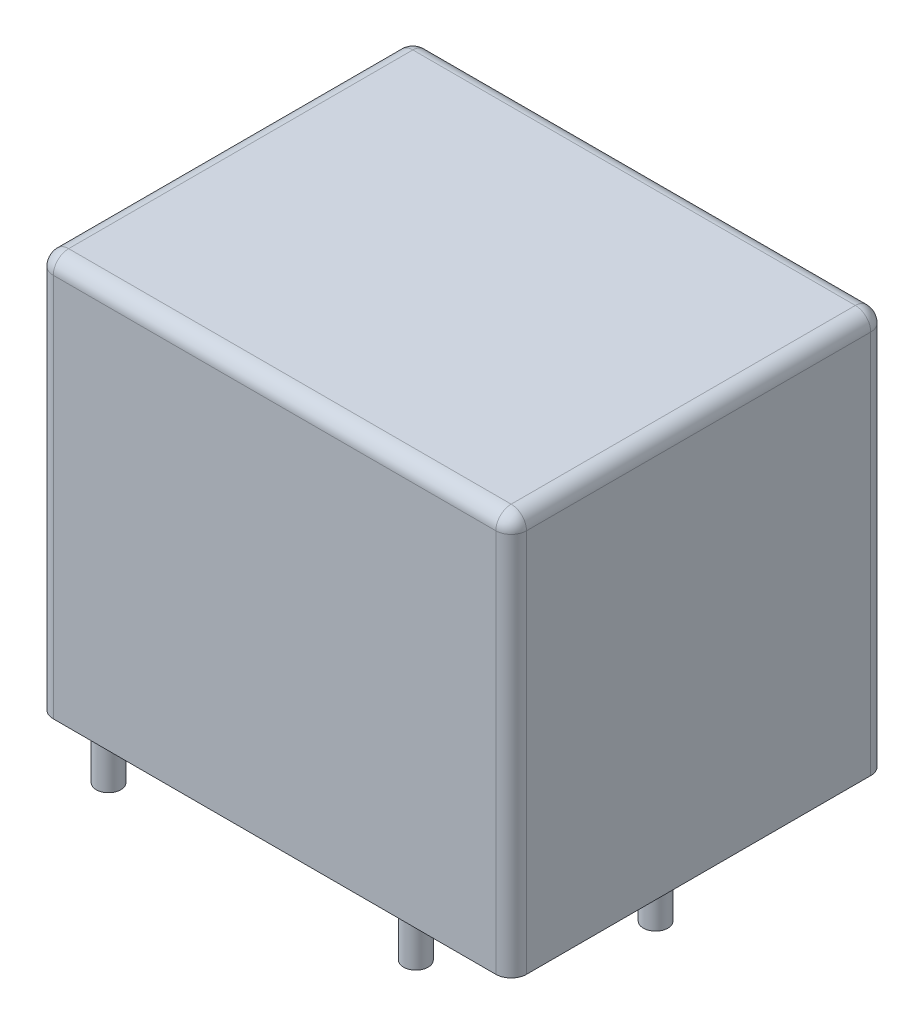
ISO-10303-21;
HEADER;
FILE_DESCRIPTION(('STEP AP214'),'2;1');
FILE_NAME('part.step','',(''),(''),'','','');
FILE_SCHEMA(('AUTOMOTIVE_DESIGN { 1 0 10303 214 1 1 1 1 }'));
ENDSEC;
DATA;
#1=APPLICATION_CONTEXT('core data for automotive mechanical design processes');
#2=APPLICATION_PROTOCOL_DEFINITION('international standard','automotive_design',2000,#1);
#3=PRODUCT_CONTEXT('',#1,'mechanical');
#4=PRODUCT('Part','Part','',(#3));
#5=PRODUCT_RELATED_PRODUCT_CATEGORY('part','',(#4));
#6=PRODUCT_DEFINITION_FORMATION('','',#4);
#7=PRODUCT_DEFINITION_CONTEXT('part definition',#1,'design');
#8=PRODUCT_DEFINITION('design','',#6,#7);
#9=PRODUCT_DEFINITION_SHAPE('','',#8);
#10=(LENGTH_UNIT() NAMED_UNIT(*) SI_UNIT(.MILLI.,.METRE.));
#11=(NAMED_UNIT(*) PLANE_ANGLE_UNIT() SI_UNIT($,.RADIAN.));
#12=(NAMED_UNIT(*) SI_UNIT($,.STERADIAN.) SOLID_ANGLE_UNIT());
#13=UNCERTAINTY_MEASURE_WITH_UNIT(LENGTH_MEASURE(1.E-05),#10,'distance_accuracy_value','');
#14=(GEOMETRIC_REPRESENTATION_CONTEXT(3) GLOBAL_UNCERTAINTY_ASSIGNED_CONTEXT((#13)) GLOBAL_UNIT_ASSIGNED_CONTEXT((#10,
#11,#12)) REPRESENTATION_CONTEXT('',''));
#15=CARTESIAN_POINT('',(0.,0.,0.));
#16=DIRECTION('',(0.,0.,1.));
#17=DIRECTION('',(1.,0.,0.));
#18=AXIS2_PLACEMENT_3D('',#15,#16,#17);
#19=CARTESIAN_POINT('',(7.2,12.5,-5.6));
#20=DIRECTION('',(1.,0.,0.));
#21=DIRECTION('',(0.,0.,-1.));
#22=AXIS2_PLACEMENT_3D('',#19,#20,#21);
#23=SPHERICAL_SURFACE('',#22,0.5);
#24=CARTESIAN_POINT('',(7.2,12.5,-5.6));
#25=DIRECTION('',(0.,0.,-1.));
#26=DIRECTION('',(-1.,0.,0.));
#27=AXIS2_PLACEMENT_3D('',#24,#25,#26);
#28=CIRCLE('',#27,0.5);
#29=CARTESIAN_POINT('',(7.7,12.5,-5.6));
#30=VERTEX_POINT('',#29);
#31=CARTESIAN_POINT('',(7.2,13.,-5.6));
#32=VERTEX_POINT('',#31);
#33=EDGE_CURVE('E201',#30,#32,#28,.F.);
#34=ORIENTED_EDGE('',*,*,#33,.F.);
#35=CARTESIAN_POINT('',(7.2,12.5,-5.6));
#36=DIRECTION('',(0.,-1.,0.));
#37=DIRECTION('',(0.,0.,-1.));
#38=AXIS2_PLACEMENT_3D('',#35,#36,#37);
#39=CIRCLE('',#38,0.5);
#40=CARTESIAN_POINT('',(7.2,12.5,-6.1));
#41=VERTEX_POINT('',#40);
#42=EDGE_CURVE('E189',#41,#30,#39,.T.);
#43=ORIENTED_EDGE('',*,*,#42,.F.);
#44=CARTESIAN_POINT('',(7.2,12.5,-5.6));
#45=DIRECTION('',(-1.,0.,0.));
#46=DIRECTION('',(0.,0.,1.));
#47=AXIS2_PLACEMENT_3D('',#44,#45,#46);
#48=CIRCLE('',#47,0.5);
#49=EDGE_CURVE('E121',#32,#41,#48,.T.);
#50=ORIENTED_EDGE('',*,*,#49,.F.);
#51=EDGE_LOOP('',(#34,#43,#50));
#52=FACE_BOUND('',#51,.T.);
#53=ADVANCED_FACE('F16',(#52),#23,.T.);
#54=CARTESIAN_POINT('',(7.2,12.5,5.6));
#55=DIRECTION('',(1.,0.,0.));
#56=DIRECTION('',(0.,0.,-1.));
#57=AXIS2_PLACEMENT_3D('',#54,#55,#56);
#58=SPHERICAL_SURFACE('',#57,0.5);
#59=CARTESIAN_POINT('',(7.2,12.5,5.6));
#60=DIRECTION('',(0.,-1.,0.));
#61=DIRECTION('',(0.,0.,-1.));
#62=AXIS2_PLACEMENT_3D('',#59,#60,#61);
#63=CIRCLE('',#62,0.5);
#64=CARTESIAN_POINT('',(7.7,12.5,5.6));
#65=VERTEX_POINT('',#64);
#66=CARTESIAN_POINT('',(7.2,12.5,6.1));
#67=VERTEX_POINT('',#66);
#68=EDGE_CURVE('E159',#65,#67,#63,.T.);
#69=ORIENTED_EDGE('',*,*,#68,.F.);
#70=CARTESIAN_POINT('',(7.2,12.5,5.6));
#71=DIRECTION('',(0.,0.,-1.));
#72=DIRECTION('',(-1.,0.,0.));
#73=AXIS2_PLACEMENT_3D('',#70,#71,#72);
#74=CIRCLE('',#73,0.5);
#75=CARTESIAN_POINT('',(7.2,13.,5.6));
#76=VERTEX_POINT('',#75);
#77=EDGE_CURVE('E204',#76,#65,#74,.T.);
#78=ORIENTED_EDGE('',*,*,#77,.F.);
#79=CARTESIAN_POINT('',(7.2,12.5,5.6));
#80=DIRECTION('',(1.,0.,0.));
#81=DIRECTION('',(0.,0.,-1.));
#82=AXIS2_PLACEMENT_3D('',#79,#80,#81);
#83=CIRCLE('',#82,0.5);
#84=EDGE_CURVE('E178',#67,#76,#83,.F.);
#85=ORIENTED_EDGE('',*,*,#84,.F.);
#86=EDGE_LOOP('',(#69,#78,#85));
#87=FACE_BOUND('',#86,.T.);
#88=ADVANCED_FACE('F234',(#87),#58,.T.);
#89=CARTESIAN_POINT('',(-7.2,12.5,5.6));
#90=DIRECTION('',(1.,0.,0.));
#91=DIRECTION('',(0.,0.,-1.));
#92=AXIS2_PLACEMENT_3D('',#89,#90,#91);
#93=SPHERICAL_SURFACE('',#92,0.5);
#94=CARTESIAN_POINT('',(-7.2,12.5,5.6));
#95=DIRECTION('',(0.,-1.,0.));
#96=DIRECTION('',(0.,0.,-1.));
#97=AXIS2_PLACEMENT_3D('',#94,#95,#96);
#98=CIRCLE('',#97,0.5);
#99=CARTESIAN_POINT('',(-7.2,12.5,6.1));
#100=VERTEX_POINT('',#99);
#101=CARTESIAN_POINT('',(-7.7,12.5,5.6));
#102=VERTEX_POINT('',#101);
#103=EDGE_CURVE('E155',#100,#102,#98,.T.);
#104=ORIENTED_EDGE('',*,*,#103,.F.);
#105=CARTESIAN_POINT('',(-7.2,12.5,5.6));
#106=DIRECTION('',(1.,0.,0.));
#107=DIRECTION('',(0.,0.,-1.));
#108=AXIS2_PLACEMENT_3D('',#105,#106,#107);
#109=CIRCLE('',#108,0.5);
#110=CARTESIAN_POINT('',(-7.2,13.,5.6));
#111=VERTEX_POINT('',#110);
#112=EDGE_CURVE('E182',#111,#100,#109,.T.);
#113=ORIENTED_EDGE('',*,*,#112,.F.);
#114=CARTESIAN_POINT('',(-7.2,12.5,5.6));
#115=DIRECTION('',(0.,0.,1.));
#116=DIRECTION('',(1.,0.,0.));
#117=AXIS2_PLACEMENT_3D('',#114,#115,#116);
#118=CIRCLE('',#117,0.5);
#119=EDGE_CURVE('E115',#102,#111,#118,.F.);
#120=ORIENTED_EDGE('',*,*,#119,.F.);
#121=EDGE_LOOP('',(#104,#113,#120));
#122=FACE_BOUND('',#121,.T.);
#123=ADVANCED_FACE('F230',(#122),#93,.T.);
#124=CARTESIAN_POINT('',(0.,13.,0.));
#125=DIRECTION('',(0.,-1.,0.));
#126=DIRECTION('',(0.,0.,-1.));
#127=AXIS2_PLACEMENT_3D('',#124,#125,#126);
#128=PLANE('',#127);
#129=DIRECTION('',(1.,0.,0.));
#130=VECTOR('',#129,1.);
#131=CARTESIAN_POINT('',(0.,13.,5.6));
#132=LINE('',#131,#130);
#133=EDGE_CURVE('E181',#76,#111,#132,.F.);
#134=ORIENTED_EDGE('',*,*,#133,.F.);
#135=DIRECTION('',(0.,0.,-1.));
#136=VECTOR('',#135,1.);
#137=CARTESIAN_POINT('',(7.2,13.,0.));
#138=LINE('',#137,#136);
#139=EDGE_CURVE('E192',#32,#76,#138,.F.);
#140=ORIENTED_EDGE('',*,*,#139,.F.);
#141=DIRECTION('',(-1.,0.,0.));
#142=VECTOR('',#141,1.);
#143=CARTESIAN_POINT('',(0.,13.,-5.6));
#144=LINE('',#143,#142);
#145=CARTESIAN_POINT('',(-7.2,13.,-5.6));
#146=VERTEX_POINT('',#145);
#147=EDGE_CURVE('E108',#146,#32,#144,.F.);
#148=ORIENTED_EDGE('',*,*,#147,.F.);
#149=DIRECTION('',(0.,0.,1.));
#150=VECTOR('',#149,1.);
#151=CARTESIAN_POINT('',(-7.2,13.,0.));
#152=LINE('',#151,#150);
#153=EDGE_CURVE('E146',#111,#146,#152,.F.);
#154=ORIENTED_EDGE('',*,*,#153,.F.);
#155=EDGE_LOOP('',(#134,#140,#148,#154));
#156=FACE_BOUND('',#155,.T.);
#157=ADVANCED_FACE('F226',(#156),#128,.F.);
#158=CARTESIAN_POINT('',(-7.2,12.5,-5.6));
#159=DIRECTION('',(1.,0.,0.));
#160=DIRECTION('',(0.,0.,-1.));
#161=AXIS2_PLACEMENT_3D('',#158,#159,#160);
#162=SPHERICAL_SURFACE('',#161,0.5);
#163=CARTESIAN_POINT('',(-7.2,12.5,-5.6));
#164=DIRECTION('',(0.,0.,1.));
#165=DIRECTION('',(1.,0.,0.));
#166=AXIS2_PLACEMENT_3D('',#163,#164,#165);
#167=CIRCLE('',#166,0.5);
#168=CARTESIAN_POINT('',(-7.7,12.5,-5.6));
#169=VERTEX_POINT('',#168);
#170=EDGE_CURVE('E104',#146,#169,#167,.T.);
#171=ORIENTED_EDGE('',*,*,#170,.F.);
#172=CARTESIAN_POINT('',(-7.2,12.5,-5.6));
#173=DIRECTION('',(-1.,0.,0.));
#174=DIRECTION('',(0.,0.,1.));
#175=AXIS2_PLACEMENT_3D('',#172,#173,#174);
#176=CIRCLE('',#175,0.5);
#177=CARTESIAN_POINT('',(-7.2,12.5,-6.1));
#178=VERTEX_POINT('',#177);
#179=EDGE_CURVE('E101',#178,#146,#176,.F.);
#180=ORIENTED_EDGE('',*,*,#179,.F.);
#181=CARTESIAN_POINT('',(-7.2,12.5,-5.6));
#182=DIRECTION('',(0.,-1.,0.));
#183=DIRECTION('',(0.,0.,-1.));
#184=AXIS2_PLACEMENT_3D('',#181,#182,#183);
#185=CIRCLE('',#184,0.5);
#186=EDGE_CURVE('E69',#169,#178,#185,.T.);
#187=ORIENTED_EDGE('',*,*,#186,.F.);
#188=EDGE_LOOP('',(#171,#180,#187));
#189=FACE_BOUND('',#188,.T.);
#190=ADVANCED_FACE('F102',(#189),#162,.T.);
#191=CARTESIAN_POINT('',(6.3,-2.,0.));
#192=DIRECTION('',(0.,-1.,0.));
#193=DIRECTION('',(0.,0.,-1.));
#194=AXIS2_PLACEMENT_3D('',#191,#192,#193);
#195=PLANE('',#194);
#196=CARTESIAN_POINT('',(6.3,-2.,0.));
#197=DIRECTION('',(0.,1.,0.));
#198=DIRECTION('',(0.,0.,1.));
#199=AXIS2_PLACEMENT_3D('',#196,#197,#198);
#200=CIRCLE('',#199,0.4);
#201=CARTESIAN_POINT('',(6.3,-2.,0.399999999999999));
#202=VERTEX_POINT('',#201);
#203=EDGE_CURVE('E145',#202,#202,#200,.T.);
#204=ORIENTED_EDGE('',*,*,#203,.F.);
#205=EDGE_LOOP('',(#204));
#206=FACE_BOUND('',#205,.T.);
#207=ADVANCED_FACE('F225',(#206),#195,.T.);
#208=CARTESIAN_POINT('',(-6.5,-2.,-5.));
#209=DIRECTION('',(0.,-1.,0.));
#210=DIRECTION('',(0.,0.,-1.));
#211=AXIS2_PLACEMENT_3D('',#208,#209,#210);
#212=PLANE('',#211);
#213=CARTESIAN_POINT('',(-6.5,-2.,-5.));
#214=DIRECTION('',(0.,1.,0.));
#215=DIRECTION('',(0.,0.,1.));
#216=AXIS2_PLACEMENT_3D('',#213,#214,#215);
#217=CIRCLE('',#216,0.4);
#218=CARTESIAN_POINT('',(-6.5,-2.,-4.6));
#219=VERTEX_POINT('',#218);
#220=EDGE_CURVE('E272',#219,#219,#217,.T.);
#221=ORIENTED_EDGE('',*,*,#220,.F.);
#222=EDGE_LOOP('',(#221));
#223=FACE_BOUND('',#222,.T.);
#224=ADVANCED_FACE('F399',(#223),#212,.T.);
#225=CARTESIAN_POINT('',(3.5,-2.,-5.));
#226=DIRECTION('',(0.,-1.,0.));
#227=DIRECTION('',(0.,0.,-1.));
#228=AXIS2_PLACEMENT_3D('',#225,#226,#227);
#229=PLANE('',#228);
#230=CARTESIAN_POINT('',(3.5,-2.,-5.));
#231=DIRECTION('',(0.,1.,0.));
#232=DIRECTION('',(0.,0.,1.));
#233=AXIS2_PLACEMENT_3D('',#230,#231,#232);
#234=CIRCLE('',#233,0.4);
#235=CARTESIAN_POINT('',(3.5,-2.,-4.6));
#236=VERTEX_POINT('',#235);
#237=EDGE_CURVE('E269',#236,#236,#234,.T.);
#238=ORIENTED_EDGE('',*,*,#237,.F.);
#239=EDGE_LOOP('',(#238));
#240=FACE_BOUND('',#239,.T.);
#241=ADVANCED_FACE('F396',(#240),#229,.T.);
#242=CARTESIAN_POINT('',(3.5,-2.,5.));
#243=DIRECTION('',(0.,-1.,0.));
#244=DIRECTION('',(0.,0.,-1.));
#245=AXIS2_PLACEMENT_3D('',#242,#243,#244);
#246=PLANE('',#245);
#247=CARTESIAN_POINT('',(3.5,-2.,5.));
#248=DIRECTION('',(0.,1.,0.));
#249=DIRECTION('',(0.,0.,1.));
#250=AXIS2_PLACEMENT_3D('',#247,#248,#249);
#251=CIRCLE('',#250,0.4);
#252=CARTESIAN_POINT('',(3.5,-2.,5.4));
#253=VERTEX_POINT('',#252);
#254=EDGE_CURVE('E132',#253,#253,#251,.T.);
#255=ORIENTED_EDGE('',*,*,#254,.F.);
#256=EDGE_LOOP('',(#255));
#257=FACE_BOUND('',#256,.T.);
#258=ADVANCED_FACE('F392',(#257),#246,.T.);
#259=CARTESIAN_POINT('',(-6.5,-2.,5.));
#260=DIRECTION('',(0.,-1.,0.));
#261=DIRECTION('',(0.,0.,-1.));
#262=AXIS2_PLACEMENT_3D('',#259,#260,#261);
#263=PLANE('',#262);
#264=CARTESIAN_POINT('',(-6.5,-2.,5.));
#265=DIRECTION('',(0.,1.,0.));
#266=DIRECTION('',(0.,0.,1.));
#267=AXIS2_PLACEMENT_3D('',#264,#265,#266);
#268=CIRCLE('',#267,0.4);
#269=CARTESIAN_POINT('',(-6.5,-2.,5.4));
#270=VERTEX_POINT('',#269);
#271=EDGE_CURVE('E128',#270,#270,#268,.T.);
#272=ORIENTED_EDGE('',*,*,#271,.F.);
#273=EDGE_LOOP('',(#272));
#274=FACE_BOUND('',#273,.T.);
#275=ADVANCED_FACE('F389',(#274),#263,.T.);
#276=CARTESIAN_POINT('',(0.,12.5,-5.6));
#277=DIRECTION('',(-1.,0.,0.));
#278=DIRECTION('',(0.,0.,1.));
#279=AXIS2_PLACEMENT_3D('',#276,#277,#278);
#280=CYLINDRICAL_SURFACE('',#279,0.5);
#281=ORIENTED_EDGE('',*,*,#49,.T.);
#282=DIRECTION('',(1.,0.,0.));
#283=VECTOR('',#282,1.);
#284=CARTESIAN_POINT('',(-7.7,12.5,-6.1));
#285=LINE('',#284,#283);
#286=EDGE_CURVE('E119',#41,#178,#285,.F.);
#287=ORIENTED_EDGE('',*,*,#286,.T.);
#288=ORIENTED_EDGE('',*,*,#179,.T.);
#289=ORIENTED_EDGE('',*,*,#147,.T.);
#290=EDGE_LOOP('',(#281,#287,#288,#289));
#291=FACE_BOUND('',#290,.T.);
#292=ADVANCED_FACE('F120',(#291),#280,.T.);
#293=CARTESIAN_POINT('',(7.2,12.5,0.));
#294=DIRECTION('',(0.,0.,-1.));
#295=DIRECTION('',(-1.,0.,0.));
#296=AXIS2_PLACEMENT_3D('',#293,#294,#295);
#297=CYLINDRICAL_SURFACE('',#296,0.5);
#298=ORIENTED_EDGE('',*,*,#33,.T.);
#299=ORIENTED_EDGE('',*,*,#139,.T.);
#300=ORIENTED_EDGE('',*,*,#77,.T.);
#301=DIRECTION('',(0.,0.,1.));
#302=VECTOR('',#301,1.);
#303=CARTESIAN_POINT('',(7.7,12.5,6.1));
#304=LINE('',#303,#302);
#305=EDGE_CURVE('E195',#65,#30,#304,.F.);
#306=ORIENTED_EDGE('',*,*,#305,.T.);
#307=EDGE_LOOP('',(#298,#299,#300,#306));
#308=FACE_BOUND('',#307,.T.);
#309=ADVANCED_FACE('F319',(#308),#297,.T.);
#310=CARTESIAN_POINT('',(7.2,13.,-5.6));
#311=DIRECTION('',(0.,-1.,0.));
#312=DIRECTION('',(0.,0.,-1.));
#313=AXIS2_PLACEMENT_3D('',#310,#311,#312);
#314=CYLINDRICAL_SURFACE('',#313,0.5);
#315=CARTESIAN_POINT('',(7.2,0.,-5.6));
#316=DIRECTION('',(0.,-1.,0.));
#317=DIRECTION('',(0.,0.,-1.));
#318=AXIS2_PLACEMENT_3D('',#315,#316,#317);
#319=CIRCLE('',#318,0.5);
#320=CARTESIAN_POINT('',(7.7,0.,-5.6));
#321=VERTEX_POINT('',#320);
#322=CARTESIAN_POINT('',(7.2,0.,-6.1));
#323=VERTEX_POINT('',#322);
#324=EDGE_CURVE('E20',#321,#323,#319,.F.);
#325=ORIENTED_EDGE('',*,*,#324,.T.);
#326=DIRECTION('',(0.,1.,0.));
#327=VECTOR('',#326,1.);
#328=CARTESIAN_POINT('',(7.2,13.,-6.1));
#329=LINE('',#328,#327);
#330=EDGE_CURVE('E124',#323,#41,#329,.T.);
#331=ORIENTED_EDGE('',*,*,#330,.T.);
#332=ORIENTED_EDGE('',*,*,#42,.T.);
#333=DIRECTION('',(0.,1.,0.));
#334=VECTOR('',#333,1.);
#335=CARTESIAN_POINT('',(7.7,13.,-5.6));
#336=LINE('',#335,#334);
#337=EDGE_CURVE('E198',#30,#321,#336,.F.);
#338=ORIENTED_EDGE('',*,*,#337,.T.);
#339=EDGE_LOOP('',(#325,#331,#332,#338));
#340=FACE_BOUND('',#339,.T.);
#341=ADVANCED_FACE('F315',(#340),#314,.T.);
#342=CARTESIAN_POINT('',(0.,12.5,5.6));
#343=DIRECTION('',(1.,0.,0.));
#344=DIRECTION('',(0.,0.,-1.));
#345=AXIS2_PLACEMENT_3D('',#342,#343,#344);
#346=CYLINDRICAL_SURFACE('',#345,0.5);
#347=ORIENTED_EDGE('',*,*,#84,.T.);
#348=ORIENTED_EDGE('',*,*,#133,.T.);
#349=ORIENTED_EDGE('',*,*,#112,.T.);
#350=DIRECTION('',(-1.,0.,0.));
#351=VECTOR('',#350,1.);
#352=CARTESIAN_POINT('',(-7.7,12.5,6.1));
#353=LINE('',#352,#351);
#354=EDGE_CURVE('E171',#100,#67,#353,.F.);
#355=ORIENTED_EDGE('',*,*,#354,.T.);
#356=EDGE_LOOP('',(#347,#348,#349,#355));
#357=FACE_BOUND('',#356,.T.);
#358=ADVANCED_FACE('F323',(#357),#346,.T.);
#359=CARTESIAN_POINT('',(7.2,13.,5.6));
#360=DIRECTION('',(0.,-1.,0.));
#361=DIRECTION('',(0.,0.,-1.));
#362=AXIS2_PLACEMENT_3D('',#359,#360,#361);
#363=CYLINDRICAL_SURFACE('',#362,0.5);
#364=ORIENTED_EDGE('',*,*,#68,.T.);
#365=DIRECTION('',(0.,1.,0.));
#366=VECTOR('',#365,1.);
#367=CARTESIAN_POINT('',(7.2,13.,6.1));
#368=LINE('',#367,#366);
#369=CARTESIAN_POINT('',(7.2,0.,6.1));
#370=VERTEX_POINT('',#369);
#371=EDGE_CURVE('E174',#67,#370,#368,.F.);
#372=ORIENTED_EDGE('',*,*,#371,.T.);
#373=CARTESIAN_POINT('',(7.2,0.,5.6));
#374=DIRECTION('',(0.,-1.,0.));
#375=DIRECTION('',(0.,0.,-1.));
#376=AXIS2_PLACEMENT_3D('',#373,#374,#375);
#377=CIRCLE('',#376,0.5);
#378=CARTESIAN_POINT('',(7.7,0.,5.6));
#379=VERTEX_POINT('',#378);
#380=EDGE_CURVE('E168',#370,#379,#377,.F.);
#381=ORIENTED_EDGE('',*,*,#380,.T.);
#382=DIRECTION('',(0.,1.,0.));
#383=VECTOR('',#382,1.);
#384=CARTESIAN_POINT('',(7.7,13.,5.6));
#385=LINE('',#384,#383);
#386=EDGE_CURVE('E123',#379,#65,#385,.T.);
#387=ORIENTED_EDGE('',*,*,#386,.T.);
#388=EDGE_LOOP('',(#364,#372,#381,#387));
#389=FACE_BOUND('',#388,.T.);
#390=ADVANCED_FACE('F282',(#389),#363,.T.);
#391=CARTESIAN_POINT('',(-7.2,13.,5.6));
#392=DIRECTION('',(0.,-1.,0.));
#393=DIRECTION('',(0.,0.,-1.));
#394=AXIS2_PLACEMENT_3D('',#391,#392,#393);
#395=CYLINDRICAL_SURFACE('',#394,0.5);
#396=CARTESIAN_POINT('',(-7.2,0.,5.6));
#397=DIRECTION('',(0.,-1.,0.));
#398=DIRECTION('',(0.,0.,-1.));
#399=AXIS2_PLACEMENT_3D('',#396,#397,#398);
#400=CIRCLE('',#399,0.5);
#401=CARTESIAN_POINT('',(-7.7,0.,5.6));
#402=VERTEX_POINT('',#401);
#403=CARTESIAN_POINT('',(-7.2,0.,6.1));
#404=VERTEX_POINT('',#403);
#405=EDGE_CURVE('E158',#402,#404,#400,.F.);
#406=ORIENTED_EDGE('',*,*,#405,.T.);
#407=DIRECTION('',(0.,1.,0.));
#408=VECTOR('',#407,1.);
#409=CARTESIAN_POINT('',(-7.2,13.,6.1));
#410=LINE('',#409,#408);
#411=EDGE_CURVE('E175',#404,#100,#410,.T.);
#412=ORIENTED_EDGE('',*,*,#411,.T.);
#413=ORIENTED_EDGE('',*,*,#103,.T.);
#414=DIRECTION('',(0.,1.,0.));
#415=VECTOR('',#414,1.);
#416=CARTESIAN_POINT('',(-7.7,13.,5.6));
#417=LINE('',#416,#415);
#418=EDGE_CURVE('E298',#102,#402,#417,.F.);
#419=ORIENTED_EDGE('',*,*,#418,.T.);
#420=EDGE_LOOP('',(#406,#412,#413,#419));
#421=FACE_BOUND('',#420,.T.);
#422=ADVANCED_FACE('F332',(#421),#395,.T.);
#423=CARTESIAN_POINT('',(-7.2,13.,-5.6));
#424=DIRECTION('',(0.,-1.,0.));
#425=DIRECTION('',(0.,0.,-1.));
#426=AXIS2_PLACEMENT_3D('',#423,#424,#425);
#427=CYLINDRICAL_SURFACE('',#426,0.5);
#428=ORIENTED_EDGE('',*,*,#186,.T.);
#429=DIRECTION('',(0.,1.,0.));
#430=VECTOR('',#429,1.);
#431=CARTESIAN_POINT('',(-7.2,13.,-6.1));
#432=LINE('',#431,#430);
#433=CARTESIAN_POINT('',(-7.2,0.,-6.1));
#434=VERTEX_POINT('',#433);
#435=EDGE_CURVE('E112',#178,#434,#432,.F.);
#436=ORIENTED_EDGE('',*,*,#435,.T.);
#437=CARTESIAN_POINT('',(-7.2,0.,-5.6));
#438=DIRECTION('',(0.,-1.,0.));
#439=DIRECTION('',(0.,0.,-1.));
#440=AXIS2_PLACEMENT_3D('',#437,#438,#439);
#441=CIRCLE('',#440,0.5);
#442=CARTESIAN_POINT('',(-7.7,0.,-5.6));
#443=VERTEX_POINT('',#442);
#444=EDGE_CURVE('E35',#434,#443,#441,.F.);
#445=ORIENTED_EDGE('',*,*,#444,.T.);
#446=DIRECTION('',(0.,1.,0.));
#447=VECTOR('',#446,1.);
#448=CARTESIAN_POINT('',(-7.7,13.,-5.6));
#449=LINE('',#448,#447);
#450=EDGE_CURVE('E114',#443,#169,#449,.T.);
#451=ORIENTED_EDGE('',*,*,#450,.T.);
#452=EDGE_LOOP('',(#428,#436,#445,#451));
#453=FACE_BOUND('',#452,.T.);
#454=ADVANCED_FACE('F110',(#453),#427,.T.);
#455=CARTESIAN_POINT('',(-7.2,12.5,0.));
#456=DIRECTION('',(0.,0.,1.));
#457=DIRECTION('',(1.,0.,0.));
#458=AXIS2_PLACEMENT_3D('',#455,#456,#457);
#459=CYLINDRICAL_SURFACE('',#458,0.5);
#460=ORIENTED_EDGE('',*,*,#170,.T.);
#461=DIRECTION('',(0.,0.,-1.));
#462=VECTOR('',#461,1.);
#463=CARTESIAN_POINT('',(-7.7,12.5,6.1));
#464=LINE('',#463,#462);
#465=EDGE_CURVE('E149',#169,#102,#464,.F.);
#466=ORIENTED_EDGE('',*,*,#465,.T.);
#467=ORIENTED_EDGE('',*,*,#119,.T.);
#468=ORIENTED_EDGE('',*,*,#153,.T.);
#469=EDGE_LOOP('',(#460,#466,#467,#468));
#470=FACE_BOUND('',#469,.T.);
#471=ADVANCED_FACE('F328',(#470),#459,.T.);
#472=CARTESIAN_POINT('',(6.3,-2.,0.));
#473=DIRECTION('',(0.,1.,0.));
#474=DIRECTION('',(0.,0.,1.));
#475=AXIS2_PLACEMENT_3D('',#472,#473,#474);
#476=CYLINDRICAL_SURFACE('',#475,0.4);
#477=CARTESIAN_POINT('',(6.3,0.,0.));
#478=DIRECTION('',(0.,1.,0.));
#479=DIRECTION('',(0.,0.,1.));
#480=AXIS2_PLACEMENT_3D('',#477,#478,#479);
#481=CIRCLE('',#480,0.4);
#482=CARTESIAN_POINT('',(6.3,0.,0.399999999999999));
#483=VERTEX_POINT('',#482);
#484=EDGE_CURVE('E152',#483,#483,#481,.T.);
#485=ORIENTED_EDGE('',*,*,#484,.F.);
#486=EDGE_LOOP('',(#485));
#487=FACE_BOUND('',#486,.T.);
#488=ORIENTED_EDGE('',*,*,#203,.T.);
#489=EDGE_LOOP('',(#488));
#490=FACE_BOUND('',#489,.T.);
#491=ADVANCED_FACE('F368',(#487,#490),#476,.T.);
#492=CARTESIAN_POINT('',(-6.5,-2.,-5.));
#493=DIRECTION('',(0.,1.,0.));
#494=DIRECTION('',(0.,0.,1.));
#495=AXIS2_PLACEMENT_3D('',#492,#493,#494);
#496=CYLINDRICAL_SURFACE('',#495,0.4);
#497=CARTESIAN_POINT('',(-6.5,0.,-5.));
#498=DIRECTION('',(0.,1.,0.));
#499=DIRECTION('',(0.,0.,1.));
#500=AXIS2_PLACEMENT_3D('',#497,#498,#499);
#501=CIRCLE('',#500,0.4);
#502=CARTESIAN_POINT('',(-6.5,0.,-4.6));
#503=VERTEX_POINT('',#502);
#504=EDGE_CURVE('E262',#503,#503,#501,.T.);
#505=ORIENTED_EDGE('',*,*,#504,.F.);
#506=EDGE_LOOP('',(#505));
#507=FACE_BOUND('',#506,.T.);
#508=ORIENTED_EDGE('',*,*,#220,.T.);
#509=EDGE_LOOP('',(#508));
#510=FACE_BOUND('',#509,.T.);
#511=ADVANCED_FACE('F364',(#507,#510),#496,.T.);
#512=CARTESIAN_POINT('',(3.5,-2.,-5.));
#513=DIRECTION('',(0.,1.,0.));
#514=DIRECTION('',(0.,0.,1.));
#515=AXIS2_PLACEMENT_3D('',#512,#513,#514);
#516=CYLINDRICAL_SURFACE('',#515,0.4);
#517=CARTESIAN_POINT('',(3.5,0.,-5.));
#518=DIRECTION('',(0.,1.,0.));
#519=DIRECTION('',(0.,0.,1.));
#520=AXIS2_PLACEMENT_3D('',#517,#518,#519);
#521=CIRCLE('',#520,0.4);
#522=CARTESIAN_POINT('',(3.5,0.,-4.6));
#523=VERTEX_POINT('',#522);
#524=EDGE_CURVE('E259',#523,#523,#521,.T.);
#525=ORIENTED_EDGE('',*,*,#524,.F.);
#526=EDGE_LOOP('',(#525));
#527=FACE_BOUND('',#526,.T.);
#528=ORIENTED_EDGE('',*,*,#237,.T.);
#529=EDGE_LOOP('',(#528));
#530=FACE_BOUND('',#529,.T.);
#531=ADVANCED_FACE('F360',(#527,#530),#516,.T.);
#532=CARTESIAN_POINT('',(3.5,-2.,5.));
#533=DIRECTION('',(0.,1.,0.));
#534=DIRECTION('',(0.,0.,1.));
#535=AXIS2_PLACEMENT_3D('',#532,#533,#534);
#536=CYLINDRICAL_SURFACE('',#535,0.4);
#537=CARTESIAN_POINT('',(3.5,0.,5.));
#538=DIRECTION('',(0.,1.,0.));
#539=DIRECTION('',(0.,0.,1.));
#540=AXIS2_PLACEMENT_3D('',#537,#538,#539);
#541=CIRCLE('',#540,0.4);
#542=CARTESIAN_POINT('',(3.5,0.,5.4));
#543=VERTEX_POINT('',#542);
#544=EDGE_CURVE('E256',#543,#543,#541,.T.);
#545=ORIENTED_EDGE('',*,*,#544,.F.);
#546=EDGE_LOOP('',(#545));
#547=FACE_BOUND('',#546,.T.);
#548=ORIENTED_EDGE('',*,*,#254,.T.);
#549=EDGE_LOOP('',(#548));
#550=FACE_BOUND('',#549,.T.);
#551=ADVANCED_FACE('F356',(#547,#550),#536,.T.);
#552=CARTESIAN_POINT('',(-6.5,-2.,5.));
#553=DIRECTION('',(0.,1.,0.));
#554=DIRECTION('',(0.,0.,1.));
#555=AXIS2_PLACEMENT_3D('',#552,#553,#554);
#556=CYLINDRICAL_SURFACE('',#555,0.4);
#557=CARTESIAN_POINT('',(-6.5,0.,5.));
#558=DIRECTION('',(0.,1.,0.));
#559=DIRECTION('',(0.,0.,1.));
#560=AXIS2_PLACEMENT_3D('',#557,#558,#559);
#561=CIRCLE('',#560,0.4);
#562=CARTESIAN_POINT('',(-6.5,0.,5.4));
#563=VERTEX_POINT('',#562);
#564=EDGE_CURVE('E253',#563,#563,#561,.T.);
#565=ORIENTED_EDGE('',*,*,#564,.F.);
#566=EDGE_LOOP('',(#565));
#567=FACE_BOUND('',#566,.T.);
#568=ORIENTED_EDGE('',*,*,#271,.T.);
#569=EDGE_LOOP('',(#568));
#570=FACE_BOUND('',#569,.T.);
#571=ADVANCED_FACE('F353',(#567,#570),#556,.T.);
#572=CARTESIAN_POINT('',(-7.7,13.,-6.1));
#573=DIRECTION('',(0.,0.,1.));
#574=DIRECTION('',(1.,0.,0.));
#575=AXIS2_PLACEMENT_3D('',#572,#573,#574);
#576=PLANE('',#575);
#577=ORIENTED_EDGE('',*,*,#330,.F.);
#578=DIRECTION('',(1.,0.,0.));
#579=VECTOR('',#578,1.);
#580=CARTESIAN_POINT('',(0.,0.,-6.1));
#581=LINE('',#580,#579);
#582=EDGE_CURVE('E127',#434,#323,#581,.T.);
#583=ORIENTED_EDGE('',*,*,#582,.F.);
#584=ORIENTED_EDGE('',*,*,#435,.F.);
#585=ORIENTED_EDGE('',*,*,#286,.F.);
#586=EDGE_LOOP('',(#577,#583,#584,#585));
#587=FACE_BOUND('',#586,.T.);
#588=ADVANCED_FACE('F126',(#587),#576,.F.);
#589=CARTESIAN_POINT('',(7.7,13.,6.1));
#590=DIRECTION('',(-1.,0.,0.));
#591=DIRECTION('',(0.,0.,1.));
#592=AXIS2_PLACEMENT_3D('',#589,#590,#591);
#593=PLANE('',#592);
#594=ORIENTED_EDGE('',*,*,#337,.F.);
#595=ORIENTED_EDGE('',*,*,#305,.F.);
#596=ORIENTED_EDGE('',*,*,#386,.F.);
#597=DIRECTION('',(0.,0.,-1.));
#598=VECTOR('',#597,1.);
#599=CARTESIAN_POINT('',(7.7,0.,0.));
#600=LINE('',#599,#598);
#601=EDGE_CURVE('E291',#321,#379,#600,.F.);
#602=ORIENTED_EDGE('',*,*,#601,.F.);
#603=EDGE_LOOP('',(#594,#595,#596,#602));
#604=FACE_BOUND('',#603,.T.);
#605=ADVANCED_FACE('F290',(#604),#593,.F.);
#606=CARTESIAN_POINT('',(-7.7,13.,6.1));
#607=DIRECTION('',(0.,0.,-1.));
#608=DIRECTION('',(-1.,0.,0.));
#609=AXIS2_PLACEMENT_3D('',#606,#607,#608);
#610=PLANE('',#609);
#611=ORIENTED_EDGE('',*,*,#371,.F.);
#612=ORIENTED_EDGE('',*,*,#354,.F.);
#613=ORIENTED_EDGE('',*,*,#411,.F.);
#614=DIRECTION('',(1.,0.,0.));
#615=VECTOR('',#614,1.);
#616=CARTESIAN_POINT('',(0.,0.,6.1));
#617=LINE('',#616,#615);
#618=EDGE_CURVE('E26',#370,#404,#617,.F.);
#619=ORIENTED_EDGE('',*,*,#618,.F.);
#620=EDGE_LOOP('',(#611,#612,#613,#619));
#621=FACE_BOUND('',#620,.T.);
#622=ADVANCED_FACE('F336',(#621),#610,.F.);
#623=CARTESIAN_POINT('',(-7.7,13.,6.1));
#624=DIRECTION('',(1.,0.,0.));
#625=DIRECTION('',(0.,0.,-1.));
#626=AXIS2_PLACEMENT_3D('',#623,#624,#625);
#627=PLANE('',#626);
#628=ORIENTED_EDGE('',*,*,#450,.F.);
#629=DIRECTION('',(0.,0.,-1.));
#630=VECTOR('',#629,1.);
#631=CARTESIAN_POINT('',(-7.7,0.,0.));
#632=LINE('',#631,#630);
#633=EDGE_CURVE('E11',#402,#443,#632,.T.);
#634=ORIENTED_EDGE('',*,*,#633,.F.);
#635=ORIENTED_EDGE('',*,*,#418,.F.);
#636=ORIENTED_EDGE('',*,*,#465,.F.);
#637=EDGE_LOOP('',(#628,#634,#635,#636));
#638=FACE_BOUND('',#637,.T.);
#639=ADVANCED_FACE('F338',(#638),#627,.F.);
#640=CARTESIAN_POINT('',(0.,0.,0.));
#641=DIRECTION('',(0.,-1.,0.));
#642=DIRECTION('',(0.,0.,-1.));
#643=AXIS2_PLACEMENT_3D('',#640,#641,#642);
#644=PLANE('',#643);
#645=ORIENTED_EDGE('',*,*,#633,.T.);
#646=ORIENTED_EDGE('',*,*,#444,.F.);
#647=ORIENTED_EDGE('',*,*,#582,.T.);
#648=ORIENTED_EDGE('',*,*,#324,.F.);
#649=ORIENTED_EDGE('',*,*,#601,.T.);
#650=ORIENTED_EDGE('',*,*,#380,.F.);
#651=ORIENTED_EDGE('',*,*,#618,.T.);
#652=ORIENTED_EDGE('',*,*,#405,.F.);
#653=EDGE_LOOP('',(#645,#646,#647,#648,#649,#650,#651,#652));
#654=FACE_BOUND('',#653,.T.);
#655=ORIENTED_EDGE('',*,*,#564,.T.);
#656=EDGE_LOOP('',(#655));
#657=FACE_BOUND('',#656,.T.);
#658=ORIENTED_EDGE('',*,*,#544,.T.);
#659=EDGE_LOOP('',(#658));
#660=FACE_BOUND('',#659,.T.);
#661=ORIENTED_EDGE('',*,*,#524,.T.);
#662=EDGE_LOOP('',(#661));
#663=FACE_BOUND('',#662,.T.);
#664=ORIENTED_EDGE('',*,*,#504,.T.);
#665=EDGE_LOOP('',(#664));
#666=FACE_BOUND('',#665,.T.);
#667=ORIENTED_EDGE('',*,*,#484,.T.);
#668=EDGE_LOOP('',(#667));
#669=FACE_BOUND('',#668,.T.);
#670=ADVANCED_FACE('F292',(#654,#657,#660,#663,#666,#669),#644,.T.);
#671=CLOSED_SHELL('',(#53,#88,#123,#157,#190,#207,#224,#241,#258,#275,#292,#309,#341,#358,#390,
#422,#454,#471,#491,#511,#531,#551,#571,#588,#605,#622,#639,#670));
#672=MANIFOLD_SOLID_BREP('B1',#671);
#673=ADVANCED_BREP_SHAPE_REPRESENTATION('',(#18,#672),#14);
#674=SHAPE_DEFINITION_REPRESENTATION(#9,#673);
ENDSEC;
END-ISO-10303-21;
